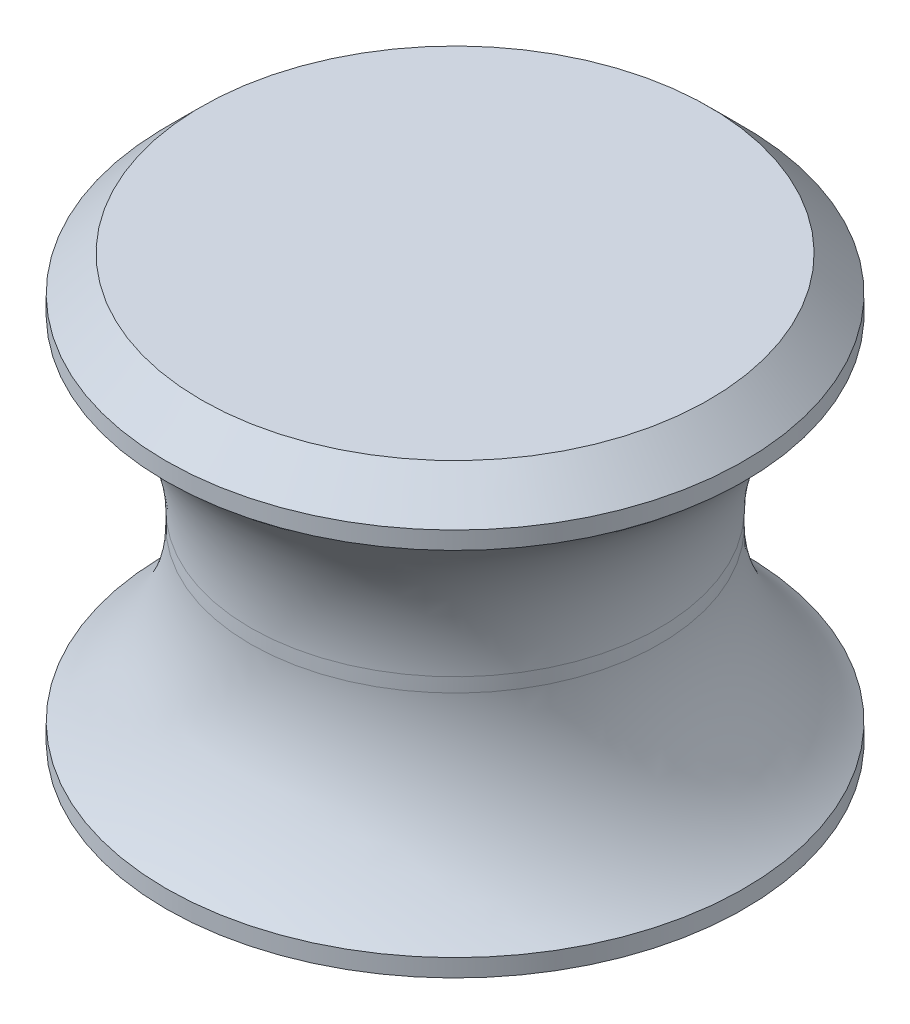
ISO-10303-21;
HEADER;
FILE_DESCRIPTION(('STEP AP214'),'2;1');
FILE_NAME('part.step','',(''),(''),'','','');
FILE_SCHEMA(('AUTOMOTIVE_DESIGN { 1 0 10303 214 1 1 1 1 }'));
ENDSEC;
DATA;
#1=APPLICATION_CONTEXT('core data for automotive mechanical design processes');
#2=APPLICATION_PROTOCOL_DEFINITION('international standard','automotive_design',2000,#1);
#3=PRODUCT_CONTEXT('',#1,'mechanical');
#4=PRODUCT('Part','Part','',(#3));
#5=PRODUCT_RELATED_PRODUCT_CATEGORY('part','',(#4));
#6=PRODUCT_DEFINITION_FORMATION('','',#4);
#7=PRODUCT_DEFINITION_CONTEXT('part definition',#1,'design');
#8=PRODUCT_DEFINITION('design','',#6,#7);
#9=PRODUCT_DEFINITION_SHAPE('','',#8);
#10=(LENGTH_UNIT() NAMED_UNIT(*) SI_UNIT(.MILLI.,.METRE.));
#11=(NAMED_UNIT(*) PLANE_ANGLE_UNIT() SI_UNIT($,.RADIAN.));
#12=(NAMED_UNIT(*) SI_UNIT($,.STERADIAN.) SOLID_ANGLE_UNIT());
#13=UNCERTAINTY_MEASURE_WITH_UNIT(LENGTH_MEASURE(1.E-05),#10,'distance_accuracy_value','');
#14=(GEOMETRIC_REPRESENTATION_CONTEXT(3) GLOBAL_UNCERTAINTY_ASSIGNED_CONTEXT((#13)) GLOBAL_UNIT_ASSIGNED_CONTEXT((#10,
#11,#12)) REPRESENTATION_CONTEXT('',''));
#15=CARTESIAN_POINT('',(0.,0.,0.));
#16=DIRECTION('',(0.,0.,1.));
#17=DIRECTION('',(1.,0.,0.));
#18=AXIS2_PLACEMENT_3D('',#15,#16,#17);
#19=CARTESIAN_POINT('',(-0.499999999999999,5.,-1.93649167310371));
#20=DIRECTION('',(1.,0.,0.));
#21=DIRECTION('',(0.,0.,-1.));
#22=AXIS2_PLACEMENT_3D('',#19,#20,#21);
#23=PLANE('',#22);
#24=DIRECTION('',(0.,-1.,0.));
#25=VECTOR('',#24,1.);
#26=CARTESIAN_POINT('',(-0.499999999999999,5.,-1.93649167310371));
#27=LINE('',#26,#25);
#28=CARTESIAN_POINT('',(-0.499999999999999,5.,-1.93649167310371));
#29=VERTEX_POINT('',#28);
#30=CARTESIAN_POINT('',(-0.499999999999999,1.3,-1.93649167310371));
#31=VERTEX_POINT('',#30);
#32=EDGE_CURVE('E135',#29,#31,#27,.T.);
#33=ORIENTED_EDGE('',*,*,#32,.T.);
#34=DIRECTION('',(0.,0.,1.));
#35=VECTOR('',#34,1.);
#36=CARTESIAN_POINT('',(-0.499999999999999,1.3,1.93649167310371));
#37=LINE('',#36,#35);
#38=CARTESIAN_POINT('',(-0.499999999999999,1.3,1.93649167310371));
#39=VERTEX_POINT('',#38);
#40=EDGE_CURVE('E155',#31,#39,#37,.T.);
#41=ORIENTED_EDGE('',*,*,#40,.T.);
#42=DIRECTION('',(0.,-1.,0.));
#43=VECTOR('',#42,1.);
#44=CARTESIAN_POINT('',(-0.499999999999999,5.,1.93649167310371));
#45=LINE('',#44,#43);
#46=CARTESIAN_POINT('',(-0.499999999999999,5.,1.93649167310371));
#47=VERTEX_POINT('',#46);
#48=EDGE_CURVE('E132',#47,#39,#45,.T.);
#49=ORIENTED_EDGE('',*,*,#48,.F.);
#50=DIRECTION('',(0.,0.,1.));
#51=VECTOR('',#50,1.);
#52=CARTESIAN_POINT('',(-0.499999999999999,5.,-1.93649167310371));
#53=LINE('',#52,#51);
#54=EDGE_CURVE('E139',#29,#47,#53,.T.);
#55=ORIENTED_EDGE('',*,*,#54,.F.);
#56=EDGE_LOOP('',(#33,#41,#49,#55));
#57=FACE_BOUND('',#56,.T.);
#58=ADVANCED_FACE('F37',(#57),#23,.F.);
#59=CARTESIAN_POINT('',(0.499999999999999,5.,0.));
#60=DIRECTION('',(1.,0.,0.));
#61=DIRECTION('',(0.,0.,-1.));
#62=AXIS2_PLACEMENT_3D('',#59,#60,#61);
#63=PLANE('',#62);
#64=DIRECTION('',(0.,-1.,0.));
#65=VECTOR('',#64,1.);
#66=CARTESIAN_POINT('',(0.499999999999999,5.,1.93649167310371));
#67=LINE('',#66,#65);
#68=CARTESIAN_POINT('',(0.499999999999999,5.,1.93649167310371));
#69=VERTEX_POINT('',#68);
#70=CARTESIAN_POINT('',(0.499999999999999,1.3,1.93649167310371));
#71=VERTEX_POINT('',#70);
#72=EDGE_CURVE('E116',#69,#71,#67,.T.);
#73=ORIENTED_EDGE('',*,*,#72,.T.);
#74=DIRECTION('',(0.,0.,-1.));
#75=VECTOR('',#74,1.);
#76=CARTESIAN_POINT('',(0.499999999999999,1.3,0.));
#77=LINE('',#76,#75);
#78=CARTESIAN_POINT('',(0.499999999999999,1.3,-1.93649167310371));
#79=VERTEX_POINT('',#78);
#80=EDGE_CURVE('E148',#71,#79,#77,.T.);
#81=ORIENTED_EDGE('',*,*,#80,.T.);
#82=DIRECTION('',(0.,-1.,0.));
#83=VECTOR('',#82,1.);
#84=CARTESIAN_POINT('',(0.499999999999999,5.,-1.93649167310371));
#85=LINE('',#84,#83);
#86=CARTESIAN_POINT('',(0.499999999999999,5.,-1.93649167310371));
#87=VERTEX_POINT('',#86);
#88=EDGE_CURVE('E110',#87,#79,#85,.T.);
#89=ORIENTED_EDGE('',*,*,#88,.F.);
#90=DIRECTION('',(0.,0.,1.));
#91=VECTOR('',#90,1.);
#92=CARTESIAN_POINT('',(0.499999999999999,5.,0.));
#93=LINE('',#92,#91);
#94=EDGE_CURVE('E105',#87,#69,#93,.T.);
#95=ORIENTED_EDGE('',*,*,#94,.T.);
#96=EDGE_LOOP('',(#73,#81,#89,#95));
#97=FACE_BOUND('',#96,.T.);
#98=ADVANCED_FACE('F114',(#97),#63,.T.);
#99=CARTESIAN_POINT('',(0.,6.,0.));
#100=DIRECTION('',(0.,-1.,0.));
#101=DIRECTION('',(0.,0.,-1.));
#102=AXIS2_PLACEMENT_3D('',#99,#100,#101);
#103=CYLINDRICAL_SURFACE('',#102,4.1);
#104=CARTESIAN_POINT('',(0.,0.,0.));
#105=DIRECTION('',(0.,1.,0.));
#106=DIRECTION('',(0.,0.,1.));
#107=AXIS2_PLACEMENT_3D('',#104,#105,#106);
#108=CIRCLE('',#107,4.1);
#109=CARTESIAN_POINT('',(0.,0.,4.1));
#110=VERTEX_POINT('',#109);
#111=EDGE_CURVE('E125',#110,#110,#108,.T.);
#112=ORIENTED_EDGE('',*,*,#111,.T.);
#113=EDGE_LOOP('',(#112));
#114=FACE_BOUND('',#113,.T.);
#115=CARTESIAN_POINT('',(0.,0.249999999999996,0.));
#116=DIRECTION('',(0.,-1.,0.));
#117=DIRECTION('',(0.,0.,1.));
#118=AXIS2_PLACEMENT_3D('',#115,#116,#117);
#119=CIRCLE('',#118,4.1);
#120=CARTESIAN_POINT('',(0.,0.249999999999995,4.1));
#121=VERTEX_POINT('',#120);
#122=EDGE_CURVE('E136',#121,#121,#119,.T.);
#123=ORIENTED_EDGE('',*,*,#122,.T.);
#124=EDGE_LOOP('',(#123));
#125=FACE_BOUND('',#124,.T.);
#126=ADVANCED_FACE('F187',(#114,#125),#103,.T.);
#127=CARTESIAN_POINT('',(0.,0.,0.));
#128=DIRECTION('',(0.,1.,0.));
#129=DIRECTION('',(0.,0.,1.));
#130=AXIS2_PLACEMENT_3D('',#127,#128,#129);
#131=PLANE('',#130);
#132=CARTESIAN_POINT('',(0.,0.,0.));
#133=DIRECTION('',(0.,1.,0.));
#134=DIRECTION('',(0.,0.,1.));
#135=AXIS2_PLACEMENT_3D('',#132,#133,#134);
#136=CIRCLE('',#135,2.3);
#137=CARTESIAN_POINT('',(0.,0.,2.3));
#138=VERTEX_POINT('',#137);
#139=EDGE_CURVE('E157',#138,#138,#136,.T.);
#140=ORIENTED_EDGE('',*,*,#139,.T.);
#141=EDGE_LOOP('',(#140));
#142=FACE_BOUND('',#141,.T.);
#143=ORIENTED_EDGE('',*,*,#111,.F.);
#144=EDGE_LOOP('',(#143));
#145=FACE_BOUND('',#144,.T.);
#146=ADVANCED_FACE('F189',(#142,#145),#131,.F.);
#147=CARTESIAN_POINT('',(0.,5.,0.));
#148=DIRECTION('',(0.,1.,0.));
#149=DIRECTION('',(0.,0.,1.));
#150=AXIS2_PLACEMENT_3D('',#147,#148,#149);
#151=PLANE('',#150);
#152=CARTESIAN_POINT('',(0.,5.,0.));
#153=DIRECTION('',(0.,1.,0.));
#154=DIRECTION('',(0.,0.,1.));
#155=AXIS2_PLACEMENT_3D('',#152,#153,#154);
#156=CIRCLE('',#155,2.);
#157=EDGE_CURVE('E118',#29,#47,#156,.T.);
#158=ORIENTED_EDGE('',*,*,#157,.F.);
#159=ORIENTED_EDGE('',*,*,#54,.T.);
#160=EDGE_LOOP('',(#158,#159));
#161=FACE_BOUND('',#160,.T.);
#162=ADVANCED_FACE('F197',(#161),#151,.F.);
#163=CARTESIAN_POINT('',(0.,5.,0.));
#164=DIRECTION('',(0.,-1.,0.));
#165=DIRECTION('',(0.,0.,-1.));
#166=AXIS2_PLACEMENT_3D('',#163,#164,#165);
#167=CYLINDRICAL_SURFACE('',#166,2.);
#168=CARTESIAN_POINT('',(0.,0.300000000000002,0.));
#169=DIRECTION('',(0.,1.,0.));
#170=DIRECTION('',(0.,0.,1.));
#171=AXIS2_PLACEMENT_3D('',#168,#169,#170);
#172=CIRCLE('',#171,2.);
#173=CARTESIAN_POINT('',(0.,0.300000000000002,2.));
#174=VERTEX_POINT('',#173);
#175=EDGE_CURVE('E160',#174,#174,#172,.F.);
#176=ORIENTED_EDGE('',*,*,#175,.T.);
#177=EDGE_LOOP('',(#176));
#178=FACE_BOUND('',#177,.T.);
#179=CARTESIAN_POINT('',(0.,1.,0.));
#180=DIRECTION('',(0.,-1.,0.));
#181=DIRECTION('',(0.,0.,-1.));
#182=AXIS2_PLACEMENT_3D('',#179,#180,#181);
#183=CIRCLE('',#182,2.);
#184=CARTESIAN_POINT('',(-0.200000000000001,1.,-1.98997487421324));
#185=VERTEX_POINT('',#184);
#186=CARTESIAN_POINT('',(0.2,1.,-1.98997487421324));
#187=VERTEX_POINT('',#186);
#188=EDGE_CURVE('E171',#185,#187,#183,.T.);
#189=ORIENTED_EDGE('',*,*,#188,.F.);
#190=CARTESIAN_POINT('',(0.,0.799999999999999,0.));
#191=DIRECTION('',(-0.707106781186547,-0.707106781186547,0.));
#192=DIRECTION('',(0.707106781186548,-0.707106781186548,0.));
#193=AXIS2_PLACEMENT_3D('',#190,#191,#192);
#194=ELLIPSE('',#193,2.82842712474619,2.);
#195=EDGE_CURVE('E166',#185,#31,#194,.F.);
#196=ORIENTED_EDGE('',*,*,#195,.T.);
#197=ORIENTED_EDGE('',*,*,#32,.F.);
#198=ORIENTED_EDGE('',*,*,#157,.T.);
#199=ORIENTED_EDGE('',*,*,#48,.T.);
#200=CARTESIAN_POINT('',(0.,0.799999999999999,0.));
#201=DIRECTION('',(-0.707106781186547,-0.707106781186547,0.));
#202=DIRECTION('',(0.707106781186548,-0.707106781186548,0.));
#203=AXIS2_PLACEMENT_3D('',#200,#201,#202);
#204=ELLIPSE('',#203,2.82842712474619,2.);
#205=CARTESIAN_POINT('',(-0.200000000000001,1.,1.98997487421324));
#206=VERTEX_POINT('',#205);
#207=EDGE_CURVE('E168',#39,#206,#204,.F.);
#208=ORIENTED_EDGE('',*,*,#207,.T.);
#209=CARTESIAN_POINT('',(0.2,1.,1.98997487421324));
#210=VERTEX_POINT('',#209);
#211=EDGE_CURVE('E173',#210,#206,#183,.T.);
#212=ORIENTED_EDGE('',*,*,#211,.F.);
#213=CARTESIAN_POINT('',(0.,0.800000000000001,0.));
#214=DIRECTION('',(-0.707106781186545,0.70710678118655,0.));
#215=DIRECTION('',(-0.70710678118655,-0.707106781186545,0.));
#216=AXIS2_PLACEMENT_3D('',#213,#214,#215);
#217=ELLIPSE('',#216,2.82842712474618,2.);
#218=EDGE_CURVE('E124',#210,#71,#217,.T.);
#219=ORIENTED_EDGE('',*,*,#218,.T.);
#220=ORIENTED_EDGE('',*,*,#72,.F.);
#221=CARTESIAN_POINT('',(0.,5.,0.));
#222=DIRECTION('',(0.,1.,0.));
#223=DIRECTION('',(0.,0.,1.));
#224=AXIS2_PLACEMENT_3D('',#221,#222,#223);
#225=CIRCLE('',#224,2.);
#226=EDGE_CURVE('E102',#69,#87,#225,.T.);
#227=ORIENTED_EDGE('',*,*,#226,.T.);
#228=ORIENTED_EDGE('',*,*,#88,.T.);
#229=CARTESIAN_POINT('',(0.,0.800000000000001,0.));
#230=DIRECTION('',(-0.707106781186545,0.70710678118655,0.));
#231=DIRECTION('',(-0.70710678118655,-0.707106781186545,0.));
#232=AXIS2_PLACEMENT_3D('',#229,#230,#231);
#233=ELLIPSE('',#232,2.82842712474618,2.);
#234=EDGE_CURVE('E163',#79,#187,#233,.T.);
#235=ORIENTED_EDGE('',*,*,#234,.T.);
#236=EDGE_LOOP('',(#189,#196,#197,#198,#199,#208,#212,#219,#220,#227,#228,#235));
#237=FACE_BOUND('',#236,.T.);
#238=ADVANCED_FACE('F121',(#178,#237),#167,.F.);
#239=CARTESIAN_POINT('',(0.,5.,0.));
#240=DIRECTION('',(0.,1.,0.));
#241=DIRECTION('',(0.,0.,1.));
#242=AXIS2_PLACEMENT_3D('',#239,#240,#241);
#243=PLANE('',#242);
#244=ORIENTED_EDGE('',*,*,#94,.F.);
#245=ORIENTED_EDGE('',*,*,#226,.F.);
#246=EDGE_LOOP('',(#244,#245));
#247=FACE_BOUND('',#246,.T.);
#248=ADVANCED_FACE('F104',(#247),#243,.F.);
#249=CARTESIAN_POINT('',(0.,5.5,0.));
#250=DIRECTION('',(0.,-1.,0.));
#251=DIRECTION('',(0.,0.,-1.));
#252=AXIS2_PLACEMENT_3D('',#249,#250,#251);
#253=CYLINDRICAL_SURFACE('',#252,2.9);
#254=DIRECTION('',(0.,1.,0.));
#255=VECTOR('',#254,1.);
#256=CARTESIAN_POINT('',(0.,5.25,2.9));
#257=LINE('',#256,#255);
#258=CARTESIAN_POINT('',(0.,2.65,2.9));
#259=VERTEX_POINT('',#258);
#260=CARTESIAN_POINT('',(0.,2.85,2.9));
#261=VERTEX_POINT('',#260);
#262=EDGE_CURVE('E180',#259,#261,#257,.T.);
#263=ORIENTED_EDGE('',*,*,#262,.T.);
#264=CARTESIAN_POINT('',(0.,2.85,0.));
#265=DIRECTION('',(0.,1.,0.));
#266=DIRECTION('',(0.,0.,1.));
#267=AXIS2_PLACEMENT_3D('',#264,#265,#266);
#268=CIRCLE('',#267,2.9);
#269=EDGE_CURVE('E11',#261,#261,#268,.F.);
#270=ORIENTED_EDGE('',*,*,#269,.T.);
#271=ORIENTED_EDGE('',*,*,#262,.F.);
#272=CARTESIAN_POINT('',(0.,2.65,0.));
#273=DIRECTION('',(0.,-1.,0.));
#274=DIRECTION('',(0.,0.,-1.));
#275=AXIS2_PLACEMENT_3D('',#272,#273,#274);
#276=CIRCLE('',#275,2.9);
#277=EDGE_CURVE('E46',#259,#259,#276,.F.);
#278=ORIENTED_EDGE('',*,*,#277,.T.);
#279=EDGE_LOOP('',(#263,#270,#271,#278));
#280=FACE_BOUND('',#279,.T.);
#281=ADVANCED_FACE('F179',(#280),#253,.T.);
#282=CARTESIAN_POINT('',(0.,6.,0.));
#283=DIRECTION('',(0.,1.,0.));
#284=DIRECTION('',(0.,0.,1.));
#285=AXIS2_PLACEMENT_3D('',#282,#283,#284);
#286=PLANE('',#285);
#287=CARTESIAN_POINT('',(0.,6.,0.));
#288=DIRECTION('',(0.,1.,0.));
#289=DIRECTION('',(0.,0.,1.));
#290=AXIS2_PLACEMENT_3D('',#287,#288,#289);
#291=CIRCLE('',#290,3.6);
#292=CARTESIAN_POINT('',(0.,6.,3.6));
#293=VERTEX_POINT('',#292);
#294=EDGE_CURVE('E128',#293,#293,#291,.T.);
#295=ORIENTED_EDGE('',*,*,#294,.T.);
#296=EDGE_LOOP('',(#295));
#297=FACE_BOUND('',#296,.T.);
#298=ADVANCED_FACE('F216',(#297),#286,.T.);
#299=CARTESIAN_POINT('',(0.,6.,0.));
#300=DIRECTION('',(0.,-1.,0.));
#301=DIRECTION('',(0.,0.,-1.));
#302=AXIS2_PLACEMENT_3D('',#299,#300,#301);
#303=CONICAL_SURFACE('',#302,3.6,0.785398163397446);
#304=CARTESIAN_POINT('',(0.,5.5,0.));
#305=DIRECTION('',(0.,1.,0.));
#306=DIRECTION('',(0.,0.,1.));
#307=AXIS2_PLACEMENT_3D('',#304,#305,#306);
#308=CIRCLE('',#307,4.1);
#309=CARTESIAN_POINT('',(0.,5.5,4.1));
#310=VERTEX_POINT('',#309);
#311=EDGE_CURVE('E145',#310,#310,#308,.F.);
#312=ORIENTED_EDGE('',*,*,#311,.F.);
#313=EDGE_LOOP('',(#312));
#314=FACE_BOUND('',#313,.T.);
#315=ORIENTED_EDGE('',*,*,#294,.F.);
#316=EDGE_LOOP('',(#315));
#317=FACE_BOUND('',#316,.T.);
#318=ADVANCED_FACE('F204',(#314,#317),#303,.T.);
#319=ORIENTED_EDGE('',*,*,#311,.T.);
#320=EDGE_LOOP('',(#319));
#321=FACE_BOUND('',#320,.T.);
#322=CARTESIAN_POINT('',(0.,5.25,0.));
#323=DIRECTION('',(0.,-1.,0.));
#324=DIRECTION('',(0.,0.,1.));
#325=AXIS2_PLACEMENT_3D('',#322,#323,#324);
#326=CIRCLE('',#325,4.1);
#327=CARTESIAN_POINT('',(0.,5.25,4.1));
#328=VERTEX_POINT('',#327);
#329=EDGE_CURVE('E181',#328,#328,#326,.T.);
#330=ORIENTED_EDGE('',*,*,#329,.F.);
#331=EDGE_LOOP('',(#330));
#332=FACE_BOUND('',#331,.T.);
#333=ADVANCED_FACE('F192',(#321,#332),#103,.T.);
#334=CARTESIAN_POINT('',(0.,1.,0.));
#335=DIRECTION('',(0.,-1.,0.));
#336=DIRECTION('',(0.,0.,-1.));
#337=AXIS2_PLACEMENT_3D('',#334,#335,#336);
#338=PLANE('',#337);
#339=ORIENTED_EDGE('',*,*,#188,.T.);
#340=DIRECTION('',(0.,0.,1.));
#341=VECTOR('',#340,1.);
#342=CARTESIAN_POINT('',(0.199999999999999,1.,0.));
#343=LINE('',#342,#341);
#344=EDGE_CURVE('E153',#187,#210,#343,.T.);
#345=ORIENTED_EDGE('',*,*,#344,.T.);
#346=ORIENTED_EDGE('',*,*,#211,.T.);
#347=DIRECTION('',(0.,0.,-1.));
#348=VECTOR('',#347,1.);
#349=CARTESIAN_POINT('',(-0.200000000000001,1.,-1.93649167310371));
#350=LINE('',#349,#348);
#351=EDGE_CURVE('E150',#206,#185,#350,.T.);
#352=ORIENTED_EDGE('',*,*,#351,.T.);
#353=EDGE_LOOP('',(#339,#345,#346,#352));
#354=FACE_BOUND('',#353,.T.);
#355=ADVANCED_FACE('F203',(#354),#338,.T.);
#356=CARTESIAN_POINT('',(0.499999999999999,1.3,0.));
#357=DIRECTION('',(-0.707106781186545,0.70710678118655,0.));
#358=DIRECTION('',(0.,0.,-1.));
#359=AXIS2_PLACEMENT_3D('',#356,#357,#358);
#360=PLANE('',#359);
#361=ORIENTED_EDGE('',*,*,#218,.F.);
#362=ORIENTED_EDGE('',*,*,#344,.F.);
#363=ORIENTED_EDGE('',*,*,#234,.F.);
#364=ORIENTED_EDGE('',*,*,#80,.F.);
#365=EDGE_LOOP('',(#361,#362,#363,#364));
#366=FACE_BOUND('',#365,.T.);
#367=ADVANCED_FACE('F251',(#366),#360,.F.);
#368=CARTESIAN_POINT('',(-0.200000000000001,1.,0.));
#369=DIRECTION('',(-0.707106781186547,-0.707106781186547,0.));
#370=DIRECTION('',(0.,0.,1.));
#371=AXIS2_PLACEMENT_3D('',#368,#369,#370);
#372=PLANE('',#371);
#373=ORIENTED_EDGE('',*,*,#207,.F.);
#374=ORIENTED_EDGE('',*,*,#40,.F.);
#375=ORIENTED_EDGE('',*,*,#195,.F.);
#376=ORIENTED_EDGE('',*,*,#351,.F.);
#377=EDGE_LOOP('',(#373,#374,#375,#376));
#378=FACE_BOUND('',#377,.T.);
#379=ADVANCED_FACE('F242',(#378),#372,.T.);
#380=CARTESIAN_POINT('',(0.,0.,0.));
#381=DIRECTION('',(0.,-1.,0.));
#382=DIRECTION('',(0.,0.,-1.));
#383=AXIS2_PLACEMENT_3D('',#380,#381,#382);
#384=CONICAL_SURFACE('',#383,2.3,0.785398163397448);
#385=ORIENTED_EDGE('',*,*,#175,.F.);
#386=EDGE_LOOP('',(#385));
#387=FACE_BOUND('',#386,.T.);
#388=ORIENTED_EDGE('',*,*,#139,.F.);
#389=EDGE_LOOP('',(#388));
#390=FACE_BOUND('',#389,.T.);
#391=ADVANCED_FACE('F238',(#387,#390),#384,.F.);
#392=CARTESIAN_POINT('',(0.,2.85,0.));
#393=DIRECTION('',(0.,1.,0.));
#394=DIRECTION('',(0.,0.,1.));
#395=AXIS2_PLACEMENT_3D('',#392,#393,#394);
#396=TOROIDAL_SURFACE('',#395,5.9,3.);
#397=CARTESIAN_POINT('',(0.,2.85,5.9));
#398=DIRECTION('',(-1.,0.,0.));
#399=DIRECTION('',(0.,0.,1.));
#400=AXIS2_PLACEMENT_3D('',#397,#398,#399);
#401=CIRCLE('',#400,3.);
#402=EDGE_CURVE('E54',#328,#261,#401,.T.);
#403=ORIENTED_EDGE('',*,*,#402,.F.);
#404=ORIENTED_EDGE('',*,*,#329,.T.);
#405=ORIENTED_EDGE('',*,*,#402,.T.);
#406=ORIENTED_EDGE('',*,*,#269,.F.);
#407=EDGE_LOOP('',(#403,#404,#405,#406));
#408=FACE_BOUND('',#407,.T.);
#409=ADVANCED_FACE('F241',(#408),#396,.F.);
#410=CARTESIAN_POINT('',(0.,2.65,0.));
#411=DIRECTION('',(0.,-1.,0.));
#412=DIRECTION('',(0.,0.,-1.));
#413=AXIS2_PLACEMENT_3D('',#410,#411,#412);
#414=TOROIDAL_SURFACE('',#413,5.9,3.);
#415=CARTESIAN_POINT('',(0.,2.65,5.9));
#416=DIRECTION('',(-1.,0.,0.));
#417=DIRECTION('',(0.,0.,1.));
#418=AXIS2_PLACEMENT_3D('',#415,#416,#417);
#419=CIRCLE('',#418,3.);
#420=EDGE_CURVE('E41',#259,#121,#419,.T.);
#421=ORIENTED_EDGE('',*,*,#420,.F.);
#422=ORIENTED_EDGE('',*,*,#277,.F.);
#423=ORIENTED_EDGE('',*,*,#420,.T.);
#424=ORIENTED_EDGE('',*,*,#122,.F.);
#425=EDGE_LOOP('',(#421,#422,#423,#424));
#426=FACE_BOUND('',#425,.T.);
#427=ADVANCED_FACE('F39',(#426),#414,.F.);
#428=CLOSED_SHELL('',(#58,#98,#126,#146,#162,#238,#248,#281,#298,#318,#333,#355,#367,#379,#391,
#409,#427));
#429=MANIFOLD_SOLID_BREP('B2',#428);
#430=ADVANCED_BREP_SHAPE_REPRESENTATION('',(#18,#429),#14);
#431=SHAPE_DEFINITION_REPRESENTATION(#9,#430);
ENDSEC;
END-ISO-10303-21;
